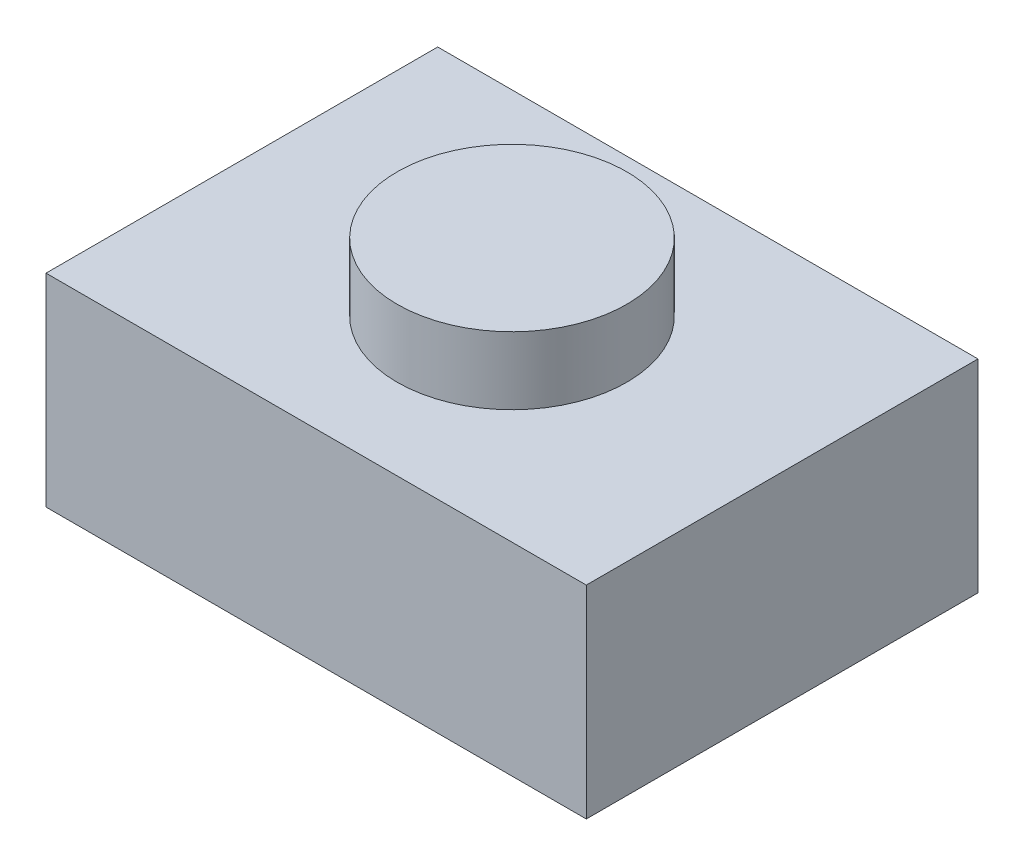
ISO-10303-21;
HEADER;
FILE_DESCRIPTION(('STEP AP214'),'2;1');
FILE_NAME('part.step','',(''),(''),'','','');
FILE_SCHEMA(('AUTOMOTIVE_DESIGN { 1 0 10303 214 1 1 1 1 }'));
ENDSEC;
DATA;
#1=APPLICATION_CONTEXT('core data for automotive mechanical design processes');
#2=APPLICATION_PROTOCOL_DEFINITION('international standard','automotive_design',2000,#1);
#3=PRODUCT_CONTEXT('',#1,'mechanical');
#4=PRODUCT('Part','Part','',(#3));
#5=PRODUCT_RELATED_PRODUCT_CATEGORY('part','',(#4));
#6=PRODUCT_DEFINITION_FORMATION('','',#4);
#7=PRODUCT_DEFINITION_CONTEXT('part definition',#1,'design');
#8=PRODUCT_DEFINITION('design','',#6,#7);
#9=PRODUCT_DEFINITION_SHAPE('','',#8);
#10=(LENGTH_UNIT() NAMED_UNIT(*) SI_UNIT(.MILLI.,.METRE.));
#11=(NAMED_UNIT(*) PLANE_ANGLE_UNIT() SI_UNIT($,.RADIAN.));
#12=(NAMED_UNIT(*) SI_UNIT($,.STERADIAN.) SOLID_ANGLE_UNIT());
#13=UNCERTAINTY_MEASURE_WITH_UNIT(LENGTH_MEASURE(1.E-05),#10,'distance_accuracy_value','');
#14=(GEOMETRIC_REPRESENTATION_CONTEXT(3) GLOBAL_UNCERTAINTY_ASSIGNED_CONTEXT((#13)) GLOBAL_UNIT_ASSIGNED_CONTEXT((#10,
#11,#12)) REPRESENTATION_CONTEXT('',''));
#15=CARTESIAN_POINT('',(0.,0.,0.));
#16=DIRECTION('',(0.,0.,1.));
#17=DIRECTION('',(1.,0.,0.));
#18=AXIS2_PLACEMENT_3D('',#15,#16,#17);
#19=CARTESIAN_POINT('',(2.,1.5,1.45));
#20=DIRECTION('',(-1.,0.,0.));
#21=DIRECTION('',(0.,0.,1.));
#22=AXIS2_PLACEMENT_3D('',#19,#20,#21);
#23=PLANE('',#22);
#24=DIRECTION('',(0.,0.,-1.));
#25=VECTOR('',#24,1.);
#26=CARTESIAN_POINT('',(2.,0.,1.45));
#27=LINE('',#26,#25);
#28=CARTESIAN_POINT('',(2.,0.,1.45));
#29=VERTEX_POINT('',#28);
#30=CARTESIAN_POINT('',(2.,0.,-1.45));
#31=VERTEX_POINT('',#30);
#32=EDGE_CURVE('E110',#29,#31,#27,.T.);
#33=ORIENTED_EDGE('',*,*,#32,.T.);
#34=DIRECTION('',(0.,-1.,0.));
#35=VECTOR('',#34,1.);
#36=CARTESIAN_POINT('',(2.,1.5,-1.45));
#37=LINE('',#36,#35);
#38=CARTESIAN_POINT('',(2.,1.5,-1.45));
#39=VERTEX_POINT('',#38);
#40=EDGE_CURVE('E42',#39,#31,#37,.T.);
#41=ORIENTED_EDGE('',*,*,#40,.F.);
#42=DIRECTION('',(0.,0.,-1.));
#43=VECTOR('',#42,1.);
#44=CARTESIAN_POINT('',(2.,1.5,1.45));
#45=LINE('',#44,#43);
#46=CARTESIAN_POINT('',(2.,1.5,1.45));
#47=VERTEX_POINT('',#46);
#48=EDGE_CURVE('E93',#47,#39,#45,.T.);
#49=ORIENTED_EDGE('',*,*,#48,.F.);
#50=DIRECTION('',(0.,-1.,0.));
#51=VECTOR('',#50,1.);
#52=CARTESIAN_POINT('',(2.,1.5,1.45));
#53=LINE('',#52,#51);
#54=EDGE_CURVE('E106',#47,#29,#53,.T.);
#55=ORIENTED_EDGE('',*,*,#54,.T.);
#56=EDGE_LOOP('',(#33,#41,#49,#55));
#57=FACE_BOUND('',#56,.T.);
#58=ADVANCED_FACE('F39',(#57),#23,.F.);
#59=CARTESIAN_POINT('',(-2.,1.5,-1.45));
#60=DIRECTION('',(0.,0.,1.));
#61=DIRECTION('',(1.,0.,0.));
#62=AXIS2_PLACEMENT_3D('',#59,#60,#61);
#63=PLANE('',#62);
#64=DIRECTION('',(-1.,0.,0.));
#65=VECTOR('',#64,1.);
#66=CARTESIAN_POINT('',(-2.,0.,-1.45));
#67=LINE('',#66,#65);
#68=CARTESIAN_POINT('',(-2.,0.,-1.45));
#69=VERTEX_POINT('',#68);
#70=EDGE_CURVE('E99',#31,#69,#67,.T.);
#71=ORIENTED_EDGE('',*,*,#70,.T.);
#72=DIRECTION('',(0.,-1.,0.));
#73=VECTOR('',#72,1.);
#74=CARTESIAN_POINT('',(-2.,1.5,-1.45));
#75=LINE('',#74,#73);
#76=CARTESIAN_POINT('',(-2.,1.5,-1.45));
#77=VERTEX_POINT('',#76);
#78=EDGE_CURVE('E97',#77,#69,#75,.T.);
#79=ORIENTED_EDGE('',*,*,#78,.F.);
#80=DIRECTION('',(-1.,0.,0.));
#81=VECTOR('',#80,1.);
#82=CARTESIAN_POINT('',(-2.,1.5,-1.45));
#83=LINE('',#82,#81);
#84=EDGE_CURVE('E88',#39,#77,#83,.T.);
#85=ORIENTED_EDGE('',*,*,#84,.F.);
#86=ORIENTED_EDGE('',*,*,#40,.T.);
#87=EDGE_LOOP('',(#71,#79,#85,#86));
#88=FACE_BOUND('',#87,.T.);
#89=ADVANCED_FACE('F98',(#88),#63,.F.);
#90=CARTESIAN_POINT('',(-2.,1.5,1.45));
#91=DIRECTION('',(1.,0.,0.));
#92=DIRECTION('',(0.,0.,-1.));
#93=AXIS2_PLACEMENT_3D('',#90,#91,#92);
#94=PLANE('',#93);
#95=DIRECTION('',(0.,0.,1.));
#96=VECTOR('',#95,1.);
#97=CARTESIAN_POINT('',(-2.,0.,1.45));
#98=LINE('',#97,#96);
#99=CARTESIAN_POINT('',(-2.,0.,1.45));
#100=VERTEX_POINT('',#99);
#101=EDGE_CURVE('E74',#69,#100,#98,.T.);
#102=ORIENTED_EDGE('',*,*,#101,.T.);
#103=DIRECTION('',(0.,-1.,0.));
#104=VECTOR('',#103,1.);
#105=CARTESIAN_POINT('',(-2.,1.5,1.45));
#106=LINE('',#105,#104);
#107=CARTESIAN_POINT('',(-2.,1.5,1.45));
#108=VERTEX_POINT('',#107);
#109=EDGE_CURVE('E101',#108,#100,#106,.T.);
#110=ORIENTED_EDGE('',*,*,#109,.F.);
#111=DIRECTION('',(0.,0.,1.));
#112=VECTOR('',#111,1.);
#113=CARTESIAN_POINT('',(-2.,1.5,1.45));
#114=LINE('',#113,#112);
#115=EDGE_CURVE('E91',#77,#108,#114,.T.);
#116=ORIENTED_EDGE('',*,*,#115,.F.);
#117=ORIENTED_EDGE('',*,*,#78,.T.);
#118=EDGE_LOOP('',(#102,#110,#116,#117));
#119=FACE_BOUND('',#118,.T.);
#120=ADVANCED_FACE('F102',(#119),#94,.F.);
#121=CARTESIAN_POINT('',(-2.,1.5,1.45));
#122=DIRECTION('',(0.,0.,-1.));
#123=DIRECTION('',(-1.,0.,0.));
#124=AXIS2_PLACEMENT_3D('',#121,#122,#123);
#125=PLANE('',#124);
#126=DIRECTION('',(1.,0.,0.));
#127=VECTOR('',#126,1.);
#128=CARTESIAN_POINT('',(-2.,0.,1.45));
#129=LINE('',#128,#127);
#130=EDGE_CURVE('E80',#100,#29,#129,.T.);
#131=ORIENTED_EDGE('',*,*,#130,.T.);
#132=ORIENTED_EDGE('',*,*,#54,.F.);
#133=DIRECTION('',(1.,0.,0.));
#134=VECTOR('',#133,1.);
#135=CARTESIAN_POINT('',(-2.,1.5,1.45));
#136=LINE('',#135,#134);
#137=EDGE_CURVE('E57',#108,#47,#136,.T.);
#138=ORIENTED_EDGE('',*,*,#137,.F.);
#139=ORIENTED_EDGE('',*,*,#109,.T.);
#140=EDGE_LOOP('',(#131,#132,#138,#139));
#141=FACE_BOUND('',#140,.T.);
#142=ADVANCED_FACE('F124',(#141),#125,.F.);
#143=CARTESIAN_POINT('',(0.,1.5,0.));
#144=DIRECTION('',(0.,-1.,0.));
#145=DIRECTION('',(0.,0.,-1.));
#146=AXIS2_PLACEMENT_3D('',#143,#144,#145);
#147=PLANE('',#146);
#148=CARTESIAN_POINT('',(0.,1.5,0.));
#149=DIRECTION('',(0.,1.,0.));
#150=DIRECTION('',(0.,0.,1.));
#151=AXIS2_PLACEMENT_3D('',#148,#149,#150);
#152=CIRCLE('',#151,0.85);
#153=CARTESIAN_POINT('',(0.,1.5,0.85));
#154=VERTEX_POINT('',#153);
#155=EDGE_CURVE('E11',#154,#154,#152,.T.);
#156=ORIENTED_EDGE('',*,*,#155,.F.);
#157=EDGE_LOOP('',(#156));
#158=FACE_BOUND('',#157,.T.);
#159=ORIENTED_EDGE('',*,*,#48,.T.);
#160=ORIENTED_EDGE('',*,*,#84,.T.);
#161=ORIENTED_EDGE('',*,*,#115,.T.);
#162=ORIENTED_EDGE('',*,*,#137,.T.);
#163=EDGE_LOOP('',(#159,#160,#161,#162));
#164=FACE_BOUND('',#163,.T.);
#165=ADVANCED_FACE('F89',(#158,#164),#147,.F.);
#166=CARTESIAN_POINT('',(0.,0.,0.));
#167=DIRECTION('',(0.,-1.,0.));
#168=DIRECTION('',(0.,0.,-1.));
#169=AXIS2_PLACEMENT_3D('',#166,#167,#168);
#170=PLANE('',#169);
#171=ORIENTED_EDGE('',*,*,#32,.F.);
#172=ORIENTED_EDGE('',*,*,#130,.F.);
#173=ORIENTED_EDGE('',*,*,#101,.F.);
#174=ORIENTED_EDGE('',*,*,#70,.F.);
#175=EDGE_LOOP('',(#171,#172,#173,#174));
#176=FACE_BOUND('',#175,.T.);
#177=ADVANCED_FACE('F127',(#176),#170,.T.);
#178=CARTESIAN_POINT('',(0.,2.,0.));
#179=DIRECTION('',(0.,-1.,0.));
#180=DIRECTION('',(0.,0.,-1.));
#181=AXIS2_PLACEMENT_3D('',#178,#179,#180);
#182=CYLINDRICAL_SURFACE('',#181,0.85);
#183=CARTESIAN_POINT('',(0.,2.,0.));
#184=DIRECTION('',(0.,1.,0.));
#185=DIRECTION('',(0.,0.,1.));
#186=AXIS2_PLACEMENT_3D('',#183,#184,#185);
#187=CIRCLE('',#186,0.85);
#188=CARTESIAN_POINT('',(0.,2.,0.85));
#189=VERTEX_POINT('',#188);
#190=EDGE_CURVE('E114',#189,#189,#187,.T.);
#191=ORIENTED_EDGE('',*,*,#190,.F.);
#192=EDGE_LOOP('',(#191));
#193=FACE_BOUND('',#192,.T.);
#194=ORIENTED_EDGE('',*,*,#155,.T.);
#195=EDGE_LOOP('',(#194));
#196=FACE_BOUND('',#195,.T.);
#197=ADVANCED_FACE('F137',(#193,#196),#182,.T.);
#198=CARTESIAN_POINT('',(0.,2.,0.));
#199=DIRECTION('',(0.,1.,0.));
#200=DIRECTION('',(0.,0.,1.));
#201=AXIS2_PLACEMENT_3D('',#198,#199,#200);
#202=PLANE('',#201);
#203=ORIENTED_EDGE('',*,*,#190,.T.);
#204=EDGE_LOOP('',(#203));
#205=FACE_BOUND('',#204,.T.);
#206=ADVANCED_FACE('F135',(#205),#202,.T.);
#207=CLOSED_SHELL('',(#58,#89,#120,#142,#165,#177,#197,#206));
#208=MANIFOLD_SOLID_BREP('B2',#207);
#209=ADVANCED_BREP_SHAPE_REPRESENTATION('',(#18,#208),#14);
#210=SHAPE_DEFINITION_REPRESENTATION(#9,#209);
ENDSEC;
END-ISO-10303-21;
